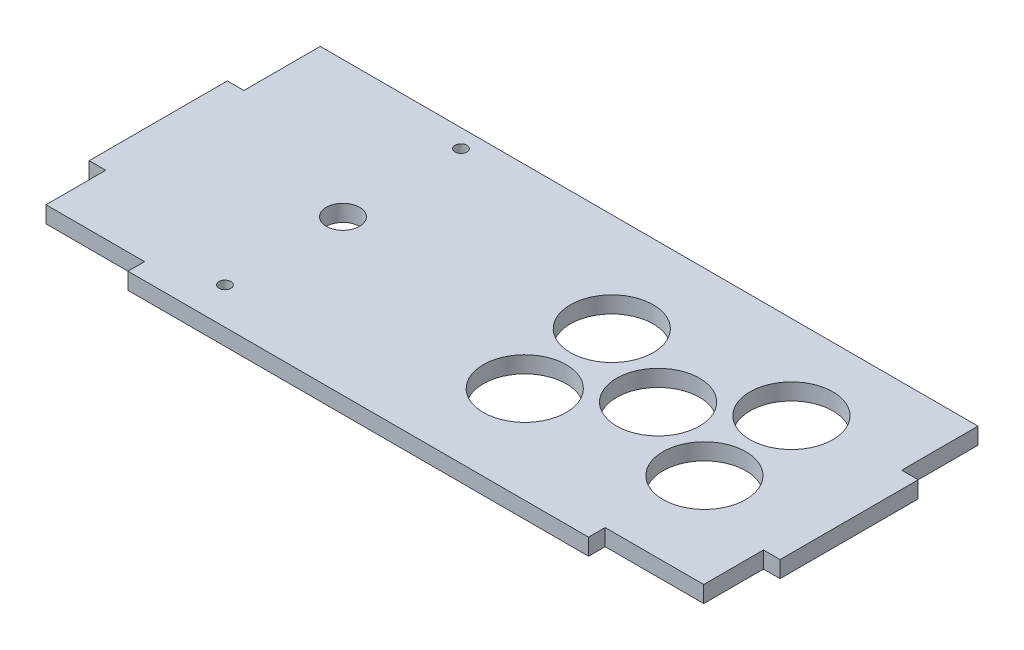
ISO-10303-21;
HEADER;
FILE_DESCRIPTION(('STEP AP214'),'2;1');
FILE_NAME('part.step','',(''),(''),'','','');
FILE_SCHEMA(('AUTOMOTIVE_DESIGN { 1 0 10303 214 1 1 1 1 }'));
ENDSEC;
DATA;
#1=APPLICATION_CONTEXT('core data for automotive mechanical design processes');
#2=APPLICATION_PROTOCOL_DEFINITION('international standard','automotive_design',2000,#1);
#3=PRODUCT_CONTEXT('',#1,'mechanical');
#4=PRODUCT('Part','Part','',(#3));
#5=PRODUCT_RELATED_PRODUCT_CATEGORY('part','',(#4));
#6=PRODUCT_DEFINITION_FORMATION('','',#4);
#7=PRODUCT_DEFINITION_CONTEXT('part definition',#1,'design');
#8=PRODUCT_DEFINITION('design','',#6,#7);
#9=PRODUCT_DEFINITION_SHAPE('','',#8);
#10=(LENGTH_UNIT() NAMED_UNIT(*) SI_UNIT(.MILLI.,.METRE.));
#11=(NAMED_UNIT(*) PLANE_ANGLE_UNIT() SI_UNIT($,.RADIAN.));
#12=(NAMED_UNIT(*) SI_UNIT($,.STERADIAN.) SOLID_ANGLE_UNIT());
#13=UNCERTAINTY_MEASURE_WITH_UNIT(LENGTH_MEASURE(1.E-05),#10,'distance_accuracy_value','');
#14=(GEOMETRIC_REPRESENTATION_CONTEXT(3) GLOBAL_UNCERTAINTY_ASSIGNED_CONTEXT((#13)) GLOBAL_UNIT_ASSIGNED_CONTEXT((#10,
#11,#12)) REPRESENTATION_CONTEXT('',''));
#15=CARTESIAN_POINT('',(0.,0.,0.));
#16=DIRECTION('',(0.,0.,1.));
#17=DIRECTION('',(1.,0.,0.));
#18=AXIS2_PLACEMENT_3D('',#15,#16,#17);
#19=CARTESIAN_POINT('',(125.,9.,-53.4646161357652));
#20=DIRECTION('',(1.,0.,0.));
#21=DIRECTION('',(0.,0.,-1.));
#22=AXIS2_PLACEMENT_3D('',#19,#20,#21);
#23=PLANE('',#22);
#24=DIRECTION('',(0.,0.,1.));
#25=VECTOR('',#24,1.);
#26=CARTESIAN_POINT('',(125.,9.,-53.4646161357652));
#27=LINE('',#26,#25);
#28=CARTESIAN_POINT('',(125.,9.,-131.087116135765));
#29=VERTEX_POINT('',#28);
#30=CARTESIAN_POINT('',(125.,9.,-81.0871161357652));
#31=VERTEX_POINT('',#30);
#32=EDGE_CURVE('E266',#29,#31,#27,.T.);
#33=ORIENTED_EDGE('',*,*,#32,.F.);
#34=DIRECTION('',(0.,1.,0.));
#35=VECTOR('',#34,1.);
#36=CARTESIAN_POINT('',(125.,3.,-131.087116135765));
#37=LINE('',#36,#35);
#38=CARTESIAN_POINT('',(125.,3.,-131.087116135765));
#39=VERTEX_POINT('',#38);
#40=EDGE_CURVE('E186',#39,#29,#37,.T.);
#41=ORIENTED_EDGE('',*,*,#40,.F.);
#42=DIRECTION('',(0.,0.,1.));
#43=VECTOR('',#42,1.);
#44=CARTESIAN_POINT('',(125.,3.,-53.4646161357652));
#45=LINE('',#44,#43);
#46=CARTESIAN_POINT('',(125.,3.,-81.0871161357652));
#47=VERTEX_POINT('',#46);
#48=EDGE_CURVE('E263',#39,#47,#45,.T.);
#49=ORIENTED_EDGE('',*,*,#48,.T.);
#50=DIRECTION('',(0.,1.,0.));
#51=VECTOR('',#50,1.);
#52=CARTESIAN_POINT('',(125.,3.,-81.0871161357652));
#53=LINE('',#52,#51);
#54=EDGE_CURVE('E190',#47,#31,#53,.T.);
#55=ORIENTED_EDGE('',*,*,#54,.T.);
#56=EDGE_LOOP('',(#33,#41,#49,#55));
#57=FACE_BOUND('',#56,.T.);
#58=ADVANCED_FACE('F35',(#57),#23,.F.);
#59=CARTESIAN_POINT('',(125.,9.,-53.4646161357652));
#60=DIRECTION('',(0.,0.,-1.));
#61=DIRECTION('',(-1.,0.,0.));
#62=AXIS2_PLACEMENT_3D('',#59,#60,#61);
#63=PLANE('',#62);
#64=DIRECTION('',(1.,0.,0.));
#65=VECTOR('',#64,1.);
#66=CARTESIAN_POINT('',(125.,9.,-53.4646161357652));
#67=LINE('',#66,#65);
#68=CARTESIAN_POINT('',(166.666666666667,9.,-53.4646161357652));
#69=VERTEX_POINT('',#68);
#70=CARTESIAN_POINT('',(333.333333333333,9.,-53.4646161357652));
#71=VERTEX_POINT('',#70);
#72=EDGE_CURVE('E269',#69,#71,#67,.T.);
#73=ORIENTED_EDGE('',*,*,#72,.F.);
#74=DIRECTION('',(0.,1.,0.));
#75=VECTOR('',#74,1.);
#76=CARTESIAN_POINT('',(166.666666666667,3.,-53.4646161357652));
#77=LINE('',#76,#75);
#78=CARTESIAN_POINT('',(166.666666666667,3.,-53.4646161357652));
#79=VERTEX_POINT('',#78);
#80=EDGE_CURVE('E243',#79,#69,#77,.T.);
#81=ORIENTED_EDGE('',*,*,#80,.F.);
#82=DIRECTION('',(1.,0.,0.));
#83=VECTOR('',#82,1.);
#84=CARTESIAN_POINT('',(125.,3.,-53.4646161357652));
#85=LINE('',#84,#83);
#86=CARTESIAN_POINT('',(333.333333333333,3.,-53.4646161357652));
#87=VERTEX_POINT('',#86);
#88=EDGE_CURVE('E275',#79,#87,#85,.T.);
#89=ORIENTED_EDGE('',*,*,#88,.T.);
#90=DIRECTION('',(0.,1.,0.));
#91=VECTOR('',#90,1.);
#92=CARTESIAN_POINT('',(333.333333333333,3.,-53.4646161357652));
#93=LINE('',#92,#91);
#94=EDGE_CURVE('E260',#87,#71,#93,.T.);
#95=ORIENTED_EDGE('',*,*,#94,.T.);
#96=EDGE_LOOP('',(#73,#81,#89,#95));
#97=FACE_BOUND('',#96,.T.);
#98=ADVANCED_FACE('F304',(#97),#63,.F.);
#99=CARTESIAN_POINT('',(375.,9.,-53.4646161357652));
#100=DIRECTION('',(-1.,0.,0.));
#101=DIRECTION('',(0.,0.,1.));
#102=AXIS2_PLACEMENT_3D('',#99,#100,#101);
#103=PLANE('',#102);
#104=DIRECTION('',(0.,0.,-1.));
#105=VECTOR('',#104,1.);
#106=CARTESIAN_POINT('',(375.,3.,-53.4646161357652));
#107=LINE('',#106,#105);
#108=CARTESIAN_POINT('',(375.,3.,-81.0871161357652));
#109=VERTEX_POINT('',#108);
#110=CARTESIAN_POINT('',(375.,3.,-131.087116135765));
#111=VERTEX_POINT('',#110);
#112=EDGE_CURVE('E276',#109,#111,#107,.T.);
#113=ORIENTED_EDGE('',*,*,#112,.T.);
#114=DIRECTION('',(0.,1.,0.));
#115=VECTOR('',#114,1.);
#116=CARTESIAN_POINT('',(375.,3.,-131.087116135765));
#117=LINE('',#116,#115);
#118=CARTESIAN_POINT('',(375.,9.,-131.087116135765));
#119=VERTEX_POINT('',#118);
#120=EDGE_CURVE('E169',#111,#119,#117,.T.);
#121=ORIENTED_EDGE('',*,*,#120,.T.);
#122=DIRECTION('',(0.,0.,-1.));
#123=VECTOR('',#122,1.);
#124=CARTESIAN_POINT('',(375.,9.,-53.4646161357652));
#125=LINE('',#124,#123);
#126=CARTESIAN_POINT('',(375.,9.,-81.0871161357652));
#127=VERTEX_POINT('',#126);
#128=EDGE_CURVE('E43',#127,#119,#125,.T.);
#129=ORIENTED_EDGE('',*,*,#128,.F.);
#130=DIRECTION('',(0.,1.,0.));
#131=VECTOR('',#130,1.);
#132=CARTESIAN_POINT('',(375.,3.,-81.0871161357652));
#133=LINE('',#132,#131);
#134=EDGE_CURVE('E215',#109,#127,#133,.T.);
#135=ORIENTED_EDGE('',*,*,#134,.F.);
#136=EDGE_LOOP('',(#113,#121,#129,#135));
#137=FACE_BOUND('',#136,.T.);
#138=ADVANCED_FACE('F286',(#137),#103,.F.);
#139=CARTESIAN_POINT('',(125.,9.,-158.709616135765));
#140=DIRECTION('',(0.,0.,1.));
#141=DIRECTION('',(1.,0.,0.));
#142=AXIS2_PLACEMENT_3D('',#139,#140,#141);
#143=PLANE('',#142);
#144=DIRECTION('',(-1.,0.,0.));
#145=VECTOR('',#144,1.);
#146=CARTESIAN_POINT('',(125.,9.,-158.709616135765));
#147=LINE('',#146,#145);
#148=CARTESIAN_POINT('',(369.,9.,-158.709616135765));
#149=VERTEX_POINT('',#148);
#150=CARTESIAN_POINT('',(131.,9.,-158.709616135765));
#151=VERTEX_POINT('',#150);
#152=EDGE_CURVE('E11',#149,#151,#147,.T.);
#153=ORIENTED_EDGE('',*,*,#152,.F.);
#154=DIRECTION('',(0.,1.,0.));
#155=VECTOR('',#154,1.);
#156=CARTESIAN_POINT('',(369.,3.,-158.709616135765));
#157=LINE('',#156,#155);
#158=CARTESIAN_POINT('',(369.,3.,-158.709616135765));
#159=VERTEX_POINT('',#158);
#160=EDGE_CURVE('E160',#159,#149,#157,.T.);
#161=ORIENTED_EDGE('',*,*,#160,.F.);
#162=DIRECTION('',(-1.,0.,0.));
#163=VECTOR('',#162,1.);
#164=CARTESIAN_POINT('',(125.,3.,-158.709616135765));
#165=LINE('',#164,#163);
#166=CARTESIAN_POINT('',(131.,3.,-158.709616135765));
#167=VERTEX_POINT('',#166);
#168=EDGE_CURVE('E38',#159,#167,#165,.T.);
#169=ORIENTED_EDGE('',*,*,#168,.T.);
#170=DIRECTION('',(0.,1.,0.));
#171=VECTOR('',#170,1.);
#172=CARTESIAN_POINT('',(131.,3.,-158.709616135765));
#173=LINE('',#172,#171);
#174=EDGE_CURVE('E226',#167,#151,#173,.T.);
#175=ORIENTED_EDGE('',*,*,#174,.T.);
#176=EDGE_LOOP('',(#153,#161,#169,#175));
#177=FACE_BOUND('',#176,.T.);
#178=ADVANCED_FACE('F281',(#177),#143,.F.);
#179=CARTESIAN_POINT('',(125.,9.,-53.4646161357652));
#180=DIRECTION('',(0.,-1.,0.));
#181=DIRECTION('',(0.,0.,-1.));
#182=AXIS2_PLACEMENT_3D('',#179,#180,#181);
#183=PLANE('',#182);
#184=CARTESIAN_POINT('',(275.228318114495,9.,-88.4802715709065));
#185=DIRECTION('',(0.,1.,0.));
#186=DIRECTION('',(0.,0.,1.));
#187=AXIS2_PLACEMENT_3D('',#184,#185,#186);
#188=CIRCLE('',#187,15.);
#189=CARTESIAN_POINT('',(275.228318114495,9.,-73.4802715709065));
#190=VERTEX_POINT('',#189);
#191=EDGE_CURVE('E517',#190,#190,#188,.T.);
#192=ORIENTED_EDGE('',*,*,#191,.F.);
#193=EDGE_LOOP('',(#192));
#194=FACE_BOUND('',#193,.T.);
#195=CARTESIAN_POINT('',(335.,9.,-93.7096161357652));
#196=DIRECTION('',(0.,1.,0.));
#197=DIRECTION('',(0.,0.,1.));
#198=AXIS2_PLACEMENT_3D('',#195,#196,#197);
#199=CIRCLE('',#198,15.);
#200=CARTESIAN_POINT('',(335.,9.,-78.7096161357652));
#201=VERTEX_POINT('',#200);
#202=EDGE_CURVE('E519',#201,#201,#199,.T.);
#203=ORIENTED_EDGE('',*,*,#202,.F.);
#204=EDGE_LOOP('',(#203));
#205=FACE_BOUND('',#204,.T.);
#206=CARTESIAN_POINT('',(303.604577311144,9.,-108.349542166592));
#207=DIRECTION('',(0.,1.,0.));
#208=DIRECTION('',(0.,0.,1.));
#209=AXIS2_PLACEMENT_3D('',#206,#207,#208);
#210=CIRCLE('',#209,15.);
#211=CARTESIAN_POINT('',(303.604577311144,9.,-93.349542166592));
#212=VERTEX_POINT('',#211);
#213=EDGE_CURVE('E527',#212,#212,#210,.T.);
#214=ORIENTED_EDGE('',*,*,#213,.F.);
#215=EDGE_LOOP('',(#214));
#216=FACE_BOUND('',#215,.T.);
#217=CARTESIAN_POINT('',(272.209154622289,9.,-122.989468197419));
#218=DIRECTION('',(0.,1.,0.));
#219=DIRECTION('',(0.,0.,1.));
#220=AXIS2_PLACEMENT_3D('',#217,#218,#219);
#221=CIRCLE('',#220,15.);
#222=CARTESIAN_POINT('',(272.209154622289,9.,-107.989468197419));
#223=VERTEX_POINT('',#222);
#224=EDGE_CURVE('E533',#223,#223,#221,.T.);
#225=ORIENTED_EDGE('',*,*,#224,.F.);
#226=EDGE_LOOP('',(#225));
#227=FACE_BOUND('',#226,.T.);
#228=CARTESIAN_POINT('',(331.980836507794,9.,-128.218812762278));
#229=DIRECTION('',(0.,1.,0.));
#230=DIRECTION('',(0.,0.,1.));
#231=AXIS2_PLACEMENT_3D('',#228,#229,#230);
#232=CIRCLE('',#231,15.);
#233=CARTESIAN_POINT('',(331.980836507794,9.,-113.218812762278));
#234=VERTEX_POINT('',#233);
#235=EDGE_CURVE('E539',#234,#234,#232,.T.);
#236=ORIENTED_EDGE('',*,*,#235,.F.);
#237=EDGE_LOOP('',(#236));
#238=FACE_BOUND('',#237,.T.);
#239=CARTESIAN_POINT('',(188.5,9.,-152.109616135765));
#240=DIRECTION('',(0.,-1.,0.));
#241=DIRECTION('',(0.,0.,-1.));
#242=AXIS2_PLACEMENT_3D('',#239,#240,#241);
#243=CIRCLE('',#242,2.14999999999999);
#244=CARTESIAN_POINT('',(188.5,9.,-154.259616135765));
#245=VERTEX_POINT('',#244);
#246=EDGE_CURVE('E548',#245,#245,#243,.T.);
#247=ORIENTED_EDGE('',*,*,#246,.T.);
#248=EDGE_LOOP('',(#247));
#249=FACE_BOUND('',#248,.T.);
#250=CARTESIAN_POINT('',(188.5,9.,-66.7096161357651));
#251=DIRECTION('',(0.,-1.,0.));
#252=DIRECTION('',(0.,0.,-1.));
#253=AXIS2_PLACEMENT_3D('',#250,#251,#252);
#254=CIRCLE('',#253,2.14999999999999);
#255=CARTESIAN_POINT('',(188.5,9.,-68.8596161357651));
#256=VERTEX_POINT('',#255);
#257=EDGE_CURVE('E554',#256,#256,#254,.T.);
#258=ORIENTED_EDGE('',*,*,#257,.T.);
#259=EDGE_LOOP('',(#258));
#260=FACE_BOUND('',#259,.T.);
#261=CARTESIAN_POINT('',(188.5,9.,-109.409616135765));
#262=DIRECTION('',(0.,1.,0.));
#263=DIRECTION('',(0.,0.,1.));
#264=AXIS2_PLACEMENT_3D('',#261,#262,#263);
#265=CIRCLE('',#264,6.00000000000001);
#266=CARTESIAN_POINT('',(188.5,9.,-103.409616135765));
#267=VERTEX_POINT('',#266);
#268=EDGE_CURVE('E556',#267,#267,#265,.T.);
#269=ORIENTED_EDGE('',*,*,#268,.F.);
#270=EDGE_LOOP('',(#269));
#271=FACE_BOUND('',#270,.T.);
#272=ORIENTED_EDGE('',*,*,#128,.T.);
#273=DIRECTION('',(1.,0.,0.));
#274=VECTOR('',#273,1.);
#275=CARTESIAN_POINT('',(375.,9.,-131.087116135765));
#276=LINE('',#275,#274);
#277=CARTESIAN_POINT('',(369.,9.,-131.087116135765));
#278=VERTEX_POINT('',#277);
#279=EDGE_CURVE('E173',#278,#119,#276,.T.);
#280=ORIENTED_EDGE('',*,*,#279,.F.);
#281=DIRECTION('',(0.,0.,1.));
#282=VECTOR('',#281,1.);
#283=CARTESIAN_POINT('',(369.,9.,-158.709616135765));
#284=LINE('',#283,#282);
#285=EDGE_CURVE('E161',#149,#278,#284,.T.);
#286=ORIENTED_EDGE('',*,*,#285,.F.);
#287=ORIENTED_EDGE('',*,*,#152,.T.);
#288=DIRECTION('',(0.,0.,-1.));
#289=VECTOR('',#288,1.);
#290=CARTESIAN_POINT('',(131.,9.,-158.709616135765));
#291=LINE('',#290,#289);
#292=CARTESIAN_POINT('',(131.,9.,-131.087116135765));
#293=VERTEX_POINT('',#292);
#294=EDGE_CURVE('E231',#293,#151,#291,.T.);
#295=ORIENTED_EDGE('',*,*,#294,.F.);
#296=DIRECTION('',(1.,0.,0.));
#297=VECTOR('',#296,1.);
#298=CARTESIAN_POINT('',(125.,9.,-131.087116135765));
#299=LINE('',#298,#297);
#300=EDGE_CURVE('E187',#29,#293,#299,.T.);
#301=ORIENTED_EDGE('',*,*,#300,.F.);
#302=ORIENTED_EDGE('',*,*,#32,.T.);
#303=DIRECTION('',(-1.,0.,0.));
#304=VECTOR('',#303,1.);
#305=CARTESIAN_POINT('',(125.,9.,-81.0871161357652));
#306=LINE('',#305,#304);
#307=CARTESIAN_POINT('',(131.,9.,-81.0871161357652));
#308=VERTEX_POINT('',#307);
#309=EDGE_CURVE('E196',#308,#31,#306,.T.);
#310=ORIENTED_EDGE('',*,*,#309,.F.);
#311=DIRECTION('',(0.,0.,-1.));
#312=VECTOR('',#311,1.);
#313=CARTESIAN_POINT('',(131.,9.,-59.4646161357652));
#314=LINE('',#313,#312);
#315=CARTESIAN_POINT('',(131.,9.,-59.4646161357652));
#316=VERTEX_POINT('',#315);
#317=EDGE_CURVE('E200',#316,#308,#314,.T.);
#318=ORIENTED_EDGE('',*,*,#317,.F.);
#319=DIRECTION('',(-1.,0.,0.));
#320=VECTOR('',#319,1.);
#321=CARTESIAN_POINT('',(125.,9.,-59.4646161357652));
#322=LINE('',#321,#320);
#323=CARTESIAN_POINT('',(166.666666666667,9.,-59.4646161357652));
#324=VERTEX_POINT('',#323);
#325=EDGE_CURVE('E240',#324,#316,#322,.T.);
#326=ORIENTED_EDGE('',*,*,#325,.F.);
#327=DIRECTION('',(0.,0.,-1.));
#328=VECTOR('',#327,1.);
#329=CARTESIAN_POINT('',(166.666666666667,9.,-53.4646161357652));
#330=LINE('',#329,#328);
#331=EDGE_CURVE('E221',#69,#324,#330,.T.);
#332=ORIENTED_EDGE('',*,*,#331,.F.);
#333=ORIENTED_EDGE('',*,*,#72,.T.);
#334=DIRECTION('',(0.,0.,1.));
#335=VECTOR('',#334,1.);
#336=CARTESIAN_POINT('',(333.333333333333,9.,-53.4646161357652));
#337=LINE('',#336,#335);
#338=CARTESIAN_POINT('',(333.333333333333,9.,-59.4646161357652));
#339=VERTEX_POINT('',#338);
#340=EDGE_CURVE('E253',#339,#71,#337,.T.);
#341=ORIENTED_EDGE('',*,*,#340,.F.);
#342=DIRECTION('',(-1.,0.,0.));
#343=VECTOR('',#342,1.);
#344=CARTESIAN_POINT('',(375.,9.,-59.4646161357652));
#345=LINE('',#344,#343);
#346=CARTESIAN_POINT('',(369.,9.,-59.4646161357652));
#347=VERTEX_POINT('',#346);
#348=EDGE_CURVE('E228',#347,#339,#345,.T.);
#349=ORIENTED_EDGE('',*,*,#348,.F.);
#350=DIRECTION('',(0.,0.,1.));
#351=VECTOR('',#350,1.);
#352=CARTESIAN_POINT('',(369.,9.,-59.4646161357652));
#353=LINE('',#352,#351);
#354=CARTESIAN_POINT('',(369.,9.,-81.0871161357652));
#355=VERTEX_POINT('',#354);
#356=EDGE_CURVE('E59',#355,#347,#353,.T.);
#357=ORIENTED_EDGE('',*,*,#356,.F.);
#358=DIRECTION('',(-1.,0.,0.));
#359=VECTOR('',#358,1.);
#360=CARTESIAN_POINT('',(375.,9.,-81.0871161357652));
#361=LINE('',#360,#359);
#362=EDGE_CURVE('E181',#127,#355,#361,.T.);
#363=ORIENTED_EDGE('',*,*,#362,.F.);
#364=EDGE_LOOP('',(#272,#280,#286,#287,#295,#301,#302,#310,#318,#326,#332,#333,#341,#349,#357,#363));
#365=FACE_BOUND('',#364,.T.);
#366=ADVANCED_FACE('F283',(#194,#205,#216,#227,#238,#249,#260,#271,#365),#183,.F.);
#367=CARTESIAN_POINT('',(125.,3.,-53.4646161357652));
#368=DIRECTION('',(0.,-1.,0.));
#369=DIRECTION('',(0.,0.,-1.));
#370=AXIS2_PLACEMENT_3D('',#367,#368,#369);
#371=PLANE('',#370);
#372=CARTESIAN_POINT('',(275.228318114495,3.,-88.4802715709065));
#373=DIRECTION('',(0.,1.,0.));
#374=DIRECTION('',(0.,0.,1.));
#375=AXIS2_PLACEMENT_3D('',#372,#373,#374);
#376=CIRCLE('',#375,15.);
#377=CARTESIAN_POINT('',(275.228318114495,3.,-73.4802715709065));
#378=VERTEX_POINT('',#377);
#379=EDGE_CURVE('E514',#378,#378,#376,.T.);
#380=ORIENTED_EDGE('',*,*,#379,.T.);
#381=EDGE_LOOP('',(#380));
#382=FACE_BOUND('',#381,.T.);
#383=CARTESIAN_POINT('',(335.,3.,-93.7096161357652));
#384=DIRECTION('',(0.,1.,0.));
#385=DIRECTION('',(0.,0.,1.));
#386=AXIS2_PLACEMENT_3D('',#383,#384,#385);
#387=CIRCLE('',#386,15.);
#388=CARTESIAN_POINT('',(335.,3.,-78.7096161357652));
#389=VERTEX_POINT('',#388);
#390=EDGE_CURVE('E524',#389,#389,#387,.T.);
#391=ORIENTED_EDGE('',*,*,#390,.T.);
#392=EDGE_LOOP('',(#391));
#393=FACE_BOUND('',#392,.T.);
#394=CARTESIAN_POINT('',(303.604577311144,3.,-108.349542166592));
#395=DIRECTION('',(0.,1.,0.));
#396=DIRECTION('',(0.,0.,1.));
#397=AXIS2_PLACEMENT_3D('',#394,#395,#396);
#398=CIRCLE('',#397,15.);
#399=CARTESIAN_POINT('',(303.604577311144,3.,-93.349542166592));
#400=VERTEX_POINT('',#399);
#401=EDGE_CURVE('E530',#400,#400,#398,.T.);
#402=ORIENTED_EDGE('',*,*,#401,.T.);
#403=EDGE_LOOP('',(#402));
#404=FACE_BOUND('',#403,.T.);
#405=CARTESIAN_POINT('',(272.209154622289,3.,-122.989468197419));
#406=DIRECTION('',(0.,1.,0.));
#407=DIRECTION('',(0.,0.,1.));
#408=AXIS2_PLACEMENT_3D('',#405,#406,#407);
#409=CIRCLE('',#408,15.);
#410=CARTESIAN_POINT('',(272.209154622289,3.,-107.989468197419));
#411=VERTEX_POINT('',#410);
#412=EDGE_CURVE('E536',#411,#411,#409,.T.);
#413=ORIENTED_EDGE('',*,*,#412,.T.);
#414=EDGE_LOOP('',(#413));
#415=FACE_BOUND('',#414,.T.);
#416=CARTESIAN_POINT('',(331.980836507794,3.,-128.218812762278));
#417=DIRECTION('',(0.,1.,0.));
#418=DIRECTION('',(0.,0.,1.));
#419=AXIS2_PLACEMENT_3D('',#416,#417,#418);
#420=CIRCLE('',#419,15.);
#421=CARTESIAN_POINT('',(331.980836507794,3.,-113.218812762278));
#422=VERTEX_POINT('',#421);
#423=EDGE_CURVE('E542',#422,#422,#420,.T.);
#424=ORIENTED_EDGE('',*,*,#423,.T.);
#425=EDGE_LOOP('',(#424));
#426=FACE_BOUND('',#425,.T.);
#427=CARTESIAN_POINT('',(188.5,3.,-152.109616135765));
#428=DIRECTION('',(0.,-1.,0.));
#429=DIRECTION('',(0.,0.,-1.));
#430=AXIS2_PLACEMENT_3D('',#427,#428,#429);
#431=CIRCLE('',#430,2.15000000000001);
#432=CARTESIAN_POINT('',(188.5,3.,-154.259616135765));
#433=VERTEX_POINT('',#432);
#434=EDGE_CURVE('E545',#433,#433,#431,.T.);
#435=ORIENTED_EDGE('',*,*,#434,.F.);
#436=EDGE_LOOP('',(#435));
#437=FACE_BOUND('',#436,.T.);
#438=CARTESIAN_POINT('',(188.5,3.,-66.7096161357651));
#439=DIRECTION('',(0.,-1.,0.));
#440=DIRECTION('',(0.,0.,-1.));
#441=AXIS2_PLACEMENT_3D('',#438,#439,#440);
#442=CIRCLE('',#441,2.15000000000001);
#443=CARTESIAN_POINT('',(188.5,3.,-68.8596161357651));
#444=VERTEX_POINT('',#443);
#445=EDGE_CURVE('E551',#444,#444,#442,.T.);
#446=ORIENTED_EDGE('',*,*,#445,.F.);
#447=EDGE_LOOP('',(#446));
#448=FACE_BOUND('',#447,.T.);
#449=CARTESIAN_POINT('',(188.5,3.,-109.409616135765));
#450=DIRECTION('',(0.,1.,0.));
#451=DIRECTION('',(0.,0.,1.));
#452=AXIS2_PLACEMENT_3D('',#449,#450,#451);
#453=CIRCLE('',#452,6.00000000000001);
#454=CARTESIAN_POINT('',(188.5,3.,-103.409616135765));
#455=VERTEX_POINT('',#454);
#456=EDGE_CURVE('E178',#455,#455,#453,.T.);
#457=ORIENTED_EDGE('',*,*,#456,.T.);
#458=EDGE_LOOP('',(#457));
#459=FACE_BOUND('',#458,.T.);
#460=DIRECTION('',(1.,0.,0.));
#461=VECTOR('',#460,1.);
#462=CARTESIAN_POINT('',(375.,3.,-131.087116135765));
#463=LINE('',#462,#461);
#464=CARTESIAN_POINT('',(369.,3.,-131.087116135765));
#465=VERTEX_POINT('',#464);
#466=EDGE_CURVE('E154',#465,#111,#463,.T.);
#467=ORIENTED_EDGE('',*,*,#466,.T.);
#468=ORIENTED_EDGE('',*,*,#112,.F.);
#469=DIRECTION('',(-1.,0.,0.));
#470=VECTOR('',#469,1.);
#471=CARTESIAN_POINT('',(375.,3.,-81.0871161357652));
#472=LINE('',#471,#470);
#473=CARTESIAN_POINT('',(369.,3.,-81.0871161357652));
#474=VERTEX_POINT('',#473);
#475=EDGE_CURVE('E209',#109,#474,#472,.T.);
#476=ORIENTED_EDGE('',*,*,#475,.T.);
#477=DIRECTION('',(0.,0.,1.));
#478=VECTOR('',#477,1.);
#479=CARTESIAN_POINT('',(369.,3.,-59.4646161357652));
#480=LINE('',#479,#478);
#481=CARTESIAN_POINT('',(369.,3.,-59.4646161357652));
#482=VERTEX_POINT('',#481);
#483=EDGE_CURVE('E212',#474,#482,#480,.T.);
#484=ORIENTED_EDGE('',*,*,#483,.T.);
#485=DIRECTION('',(-1.,0.,0.));
#486=VECTOR('',#485,1.);
#487=CARTESIAN_POINT('',(375.,3.,-59.4646161357652));
#488=LINE('',#487,#486);
#489=CARTESIAN_POINT('',(333.333333333333,3.,-59.4646161357652));
#490=VERTEX_POINT('',#489);
#491=EDGE_CURVE('E250',#482,#490,#488,.T.);
#492=ORIENTED_EDGE('',*,*,#491,.T.);
#493=DIRECTION('',(0.,0.,1.));
#494=VECTOR('',#493,1.);
#495=CARTESIAN_POINT('',(333.333333333333,3.,-53.4646161357652));
#496=LINE('',#495,#494);
#497=EDGE_CURVE('E252',#490,#87,#496,.T.);
#498=ORIENTED_EDGE('',*,*,#497,.T.);
#499=ORIENTED_EDGE('',*,*,#88,.F.);
#500=DIRECTION('',(0.,0.,-1.));
#501=VECTOR('',#500,1.);
#502=CARTESIAN_POINT('',(166.666666666667,3.,-53.4646161357652));
#503=LINE('',#502,#501);
#504=CARTESIAN_POINT('',(166.666666666667,3.,-59.4646161357652));
#505=VERTEX_POINT('',#504);
#506=EDGE_CURVE('E236',#79,#505,#503,.T.);
#507=ORIENTED_EDGE('',*,*,#506,.T.);
#508=DIRECTION('',(-1.,0.,0.));
#509=VECTOR('',#508,1.);
#510=CARTESIAN_POINT('',(125.,3.,-59.4646161357652));
#511=LINE('',#510,#509);
#512=CARTESIAN_POINT('',(131.,3.,-59.4646161357652));
#513=VERTEX_POINT('',#512);
#514=EDGE_CURVE('E239',#505,#513,#511,.T.);
#515=ORIENTED_EDGE('',*,*,#514,.T.);
#516=DIRECTION('',(0.,0.,-1.));
#517=VECTOR('',#516,1.);
#518=CARTESIAN_POINT('',(131.,3.,-59.4646161357652));
#519=LINE('',#518,#517);
#520=CARTESIAN_POINT('',(131.,3.,-81.0871161357652));
#521=VERTEX_POINT('',#520);
#522=EDGE_CURVE('E51',#513,#521,#519,.T.);
#523=ORIENTED_EDGE('',*,*,#522,.T.);
#524=DIRECTION('',(-1.,0.,0.));
#525=VECTOR('',#524,1.);
#526=CARTESIAN_POINT('',(125.,3.,-81.0871161357652));
#527=LINE('',#526,#525);
#528=EDGE_CURVE('E195',#521,#47,#527,.T.);
#529=ORIENTED_EDGE('',*,*,#528,.T.);
#530=ORIENTED_EDGE('',*,*,#48,.F.);
#531=DIRECTION('',(1.,0.,0.));
#532=VECTOR('',#531,1.);
#533=CARTESIAN_POINT('',(125.,3.,-131.087116135765));
#534=LINE('',#533,#532);
#535=CARTESIAN_POINT('',(131.,3.,-131.087116135765));
#536=VERTEX_POINT('',#535);
#537=EDGE_CURVE('E183',#39,#536,#534,.T.);
#538=ORIENTED_EDGE('',*,*,#537,.T.);
#539=DIRECTION('',(0.,0.,-1.));
#540=VECTOR('',#539,1.);
#541=CARTESIAN_POINT('',(131.,3.,-158.709616135765));
#542=LINE('',#541,#540);
#543=EDGE_CURVE('E229',#536,#167,#542,.T.);
#544=ORIENTED_EDGE('',*,*,#543,.T.);
#545=ORIENTED_EDGE('',*,*,#168,.F.);
#546=DIRECTION('',(0.,0.,1.));
#547=VECTOR('',#546,1.);
#548=CARTESIAN_POINT('',(369.,3.,-158.709616135765));
#549=LINE('',#548,#547);
#550=EDGE_CURVE('E149',#159,#465,#549,.T.);
#551=ORIENTED_EDGE('',*,*,#550,.T.);
#552=EDGE_LOOP('',(#467,#468,#476,#484,#492,#498,#499,#507,#515,#523,#529,#530,#538,#544,#545,#551));
#553=FACE_BOUND('',#552,.T.);
#554=ADVANCED_FACE('F151',(#382,#393,#404,#415,#426,#437,#448,#459,#553),#371,.T.);
#555=CARTESIAN_POINT('',(333.333333333333,3.,-53.4646161357652));
#556=DIRECTION('',(-1.,0.,0.));
#557=DIRECTION('',(0.,0.,1.));
#558=AXIS2_PLACEMENT_3D('',#555,#556,#557);
#559=PLANE('',#558);
#560=ORIENTED_EDGE('',*,*,#340,.T.);
#561=ORIENTED_EDGE('',*,*,#94,.F.);
#562=ORIENTED_EDGE('',*,*,#497,.F.);
#563=DIRECTION('',(0.,1.,0.));
#564=VECTOR('',#563,1.);
#565=CARTESIAN_POINT('',(333.333333333333,3.,-59.4646161357652));
#566=LINE('',#565,#564);
#567=EDGE_CURVE('E256',#490,#339,#566,.T.);
#568=ORIENTED_EDGE('',*,*,#567,.T.);
#569=EDGE_LOOP('',(#560,#561,#562,#568));
#570=FACE_BOUND('',#569,.T.);
#571=ADVANCED_FACE('F301',(#570),#559,.F.);
#572=CARTESIAN_POINT('',(375.,3.,-59.4646161357652));
#573=DIRECTION('',(0.,0.,-1.));
#574=DIRECTION('',(-1.,0.,0.));
#575=AXIS2_PLACEMENT_3D('',#572,#573,#574);
#576=PLANE('',#575);
#577=ORIENTED_EDGE('',*,*,#491,.F.);
#578=DIRECTION('',(0.,1.,0.));
#579=VECTOR('',#578,1.);
#580=CARTESIAN_POINT('',(369.,3.,-59.4646161357652));
#581=LINE('',#580,#579);
#582=EDGE_CURVE('E219',#482,#347,#581,.T.);
#583=ORIENTED_EDGE('',*,*,#582,.T.);
#584=ORIENTED_EDGE('',*,*,#348,.T.);
#585=ORIENTED_EDGE('',*,*,#567,.F.);
#586=EDGE_LOOP('',(#577,#583,#584,#585));
#587=FACE_BOUND('',#586,.T.);
#588=ADVANCED_FACE('F294',(#587),#576,.F.);
#589=CARTESIAN_POINT('',(125.,3.,-59.4646161357652));
#590=DIRECTION('',(0.,0.,-1.));
#591=DIRECTION('',(-1.,0.,0.));
#592=AXIS2_PLACEMENT_3D('',#589,#590,#591);
#593=PLANE('',#592);
#594=ORIENTED_EDGE('',*,*,#325,.T.);
#595=DIRECTION('',(0.,1.,0.));
#596=VECTOR('',#595,1.);
#597=CARTESIAN_POINT('',(131.,3.,-59.4646161357652));
#598=LINE('',#597,#596);
#599=EDGE_CURVE('E199',#513,#316,#598,.T.);
#600=ORIENTED_EDGE('',*,*,#599,.F.);
#601=ORIENTED_EDGE('',*,*,#514,.F.);
#602=DIRECTION('',(0.,1.,0.));
#603=VECTOR('',#602,1.);
#604=CARTESIAN_POINT('',(166.666666666667,3.,-59.4646161357652));
#605=LINE('',#604,#603);
#606=EDGE_CURVE('E233',#505,#324,#605,.T.);
#607=ORIENTED_EDGE('',*,*,#606,.T.);
#608=EDGE_LOOP('',(#594,#600,#601,#607));
#609=FACE_BOUND('',#608,.T.);
#610=ADVANCED_FACE('F312',(#609),#593,.F.);
#611=CARTESIAN_POINT('',(166.666666666667,3.,-53.4646161357652));
#612=DIRECTION('',(1.,0.,0.));
#613=DIRECTION('',(0.,0.,-1.));
#614=AXIS2_PLACEMENT_3D('',#611,#612,#613);
#615=PLANE('',#614);
#616=ORIENTED_EDGE('',*,*,#331,.T.);
#617=ORIENTED_EDGE('',*,*,#606,.F.);
#618=ORIENTED_EDGE('',*,*,#506,.F.);
#619=ORIENTED_EDGE('',*,*,#80,.T.);
#620=EDGE_LOOP('',(#616,#617,#618,#619));
#621=FACE_BOUND('',#620,.T.);
#622=ADVANCED_FACE('F309',(#621),#615,.F.);
#623=CARTESIAN_POINT('',(131.,3.,-158.709616135765));
#624=DIRECTION('',(1.,0.,0.));
#625=DIRECTION('',(0.,0.,-1.));
#626=AXIS2_PLACEMENT_3D('',#623,#624,#625);
#627=PLANE('',#626);
#628=ORIENTED_EDGE('',*,*,#294,.T.);
#629=ORIENTED_EDGE('',*,*,#174,.F.);
#630=ORIENTED_EDGE('',*,*,#543,.F.);
#631=DIRECTION('',(0.,1.,0.));
#632=VECTOR('',#631,1.);
#633=CARTESIAN_POINT('',(131.,3.,-131.087116135765));
#634=LINE('',#633,#632);
#635=EDGE_CURVE('E175',#536,#293,#634,.T.);
#636=ORIENTED_EDGE('',*,*,#635,.T.);
#637=EDGE_LOOP('',(#628,#629,#630,#636));
#638=FACE_BOUND('',#637,.T.);
#639=ADVANCED_FACE('F328',(#638),#627,.F.);
#640=CARTESIAN_POINT('',(369.,3.,-158.709616135765));
#641=DIRECTION('',(-1.,0.,0.));
#642=DIRECTION('',(0.,0.,1.));
#643=AXIS2_PLACEMENT_3D('',#640,#641,#642);
#644=PLANE('',#643);
#645=ORIENTED_EDGE('',*,*,#285,.T.);
#646=DIRECTION('',(0.,1.,0.));
#647=VECTOR('',#646,1.);
#648=CARTESIAN_POINT('',(369.,3.,-131.087116135765));
#649=LINE('',#648,#647);
#650=EDGE_CURVE('E164',#465,#278,#649,.T.);
#651=ORIENTED_EDGE('',*,*,#650,.F.);
#652=ORIENTED_EDGE('',*,*,#550,.F.);
#653=ORIENTED_EDGE('',*,*,#160,.T.);
#654=EDGE_LOOP('',(#645,#651,#652,#653));
#655=FACE_BOUND('',#654,.T.);
#656=ADVANCED_FACE('F165',(#655),#644,.F.);
#657=CARTESIAN_POINT('',(369.,3.,-59.4646161357652));
#658=DIRECTION('',(-1.,0.,0.));
#659=DIRECTION('',(0.,0.,1.));
#660=AXIS2_PLACEMENT_3D('',#657,#658,#659);
#661=PLANE('',#660);
#662=ORIENTED_EDGE('',*,*,#356,.T.);
#663=ORIENTED_EDGE('',*,*,#582,.F.);
#664=ORIENTED_EDGE('',*,*,#483,.F.);
#665=DIRECTION('',(0.,1.,0.));
#666=VECTOR('',#665,1.);
#667=CARTESIAN_POINT('',(369.,3.,-81.0871161357652));
#668=LINE('',#667,#666);
#669=EDGE_CURVE('E222',#474,#355,#668,.T.);
#670=ORIENTED_EDGE('',*,*,#669,.T.);
#671=EDGE_LOOP('',(#662,#663,#664,#670));
#672=FACE_BOUND('',#671,.T.);
#673=ADVANCED_FACE('F291',(#672),#661,.F.);
#674=CARTESIAN_POINT('',(375.,3.,-81.0871161357652));
#675=DIRECTION('',(0.,0.,-1.));
#676=DIRECTION('',(-1.,0.,0.));
#677=AXIS2_PLACEMENT_3D('',#674,#675,#676);
#678=PLANE('',#677);
#679=ORIENTED_EDGE('',*,*,#362,.T.);
#680=ORIENTED_EDGE('',*,*,#669,.F.);
#681=ORIENTED_EDGE('',*,*,#475,.F.);
#682=ORIENTED_EDGE('',*,*,#134,.T.);
#683=EDGE_LOOP('',(#679,#680,#681,#682));
#684=FACE_BOUND('',#683,.T.);
#685=ADVANCED_FACE('F290',(#684),#678,.F.);
#686=CARTESIAN_POINT('',(375.,3.,-131.087116135765));
#687=DIRECTION('',(0.,0.,1.));
#688=DIRECTION('',(1.,0.,0.));
#689=AXIS2_PLACEMENT_3D('',#686,#687,#688);
#690=PLANE('',#689);
#691=ORIENTED_EDGE('',*,*,#279,.T.);
#692=ORIENTED_EDGE('',*,*,#120,.F.);
#693=ORIENTED_EDGE('',*,*,#466,.F.);
#694=ORIENTED_EDGE('',*,*,#650,.T.);
#695=EDGE_LOOP('',(#691,#692,#693,#694));
#696=FACE_BOUND('',#695,.T.);
#697=ADVANCED_FACE('F171',(#696),#690,.F.);
#698=CARTESIAN_POINT('',(125.,3.,-131.087116135765));
#699=DIRECTION('',(0.,0.,1.));
#700=DIRECTION('',(1.,0.,0.));
#701=AXIS2_PLACEMENT_3D('',#698,#699,#700);
#702=PLANE('',#701);
#703=ORIENTED_EDGE('',*,*,#300,.T.);
#704=ORIENTED_EDGE('',*,*,#635,.F.);
#705=ORIENTED_EDGE('',*,*,#537,.F.);
#706=ORIENTED_EDGE('',*,*,#40,.T.);
#707=EDGE_LOOP('',(#703,#704,#705,#706));
#708=FACE_BOUND('',#707,.T.);
#709=ADVANCED_FACE('F326',(#708),#702,.F.);
#710=CARTESIAN_POINT('',(125.,3.,-81.0871161357652));
#711=DIRECTION('',(0.,0.,-1.));
#712=DIRECTION('',(-1.,0.,0.));
#713=AXIS2_PLACEMENT_3D('',#710,#711,#712);
#714=PLANE('',#713);
#715=ORIENTED_EDGE('',*,*,#309,.T.);
#716=ORIENTED_EDGE('',*,*,#54,.F.);
#717=ORIENTED_EDGE('',*,*,#528,.F.);
#718=DIRECTION('',(0.,1.,0.));
#719=VECTOR('',#718,1.);
#720=CARTESIAN_POINT('',(131.,3.,-81.0871161357652));
#721=LINE('',#720,#719);
#722=EDGE_CURVE('E206',#521,#308,#721,.T.);
#723=ORIENTED_EDGE('',*,*,#722,.T.);
#724=EDGE_LOOP('',(#715,#716,#717,#723));
#725=FACE_BOUND('',#724,.T.);
#726=ADVANCED_FACE('F319',(#725),#714,.F.);
#727=CARTESIAN_POINT('',(131.,3.,-59.4646161357652));
#728=DIRECTION('',(1.,0.,0.));
#729=DIRECTION('',(0.,0.,-1.));
#730=AXIS2_PLACEMENT_3D('',#727,#728,#729);
#731=PLANE('',#730);
#732=ORIENTED_EDGE('',*,*,#317,.T.);
#733=ORIENTED_EDGE('',*,*,#722,.F.);
#734=ORIENTED_EDGE('',*,*,#522,.F.);
#735=ORIENTED_EDGE('',*,*,#599,.T.);
#736=EDGE_LOOP('',(#732,#733,#734,#735));
#737=FACE_BOUND('',#736,.T.);
#738=ADVANCED_FACE('F314',(#737),#731,.F.);
#739=CARTESIAN_POINT('',(188.5,9.,-109.409616135765));
#740=DIRECTION('',(0.,1.,0.));
#741=DIRECTION('',(0.,0.,1.));
#742=AXIS2_PLACEMENT_3D('',#739,#740,#741);
#743=CYLINDRICAL_SURFACE('',#742,6.00000000000001);
#744=ORIENTED_EDGE('',*,*,#456,.F.);
#745=EDGE_LOOP('',(#744));
#746=FACE_BOUND('',#745,.T.);
#747=ORIENTED_EDGE('',*,*,#268,.T.);
#748=EDGE_LOOP('',(#747));
#749=FACE_BOUND('',#748,.T.);
#750=ADVANCED_FACE('F428',(#746,#749),#743,.F.);
#751=CARTESIAN_POINT('',(188.5,3.,-66.7096161357651));
#752=DIRECTION('',(0.,-1.,0.));
#753=DIRECTION('',(0.,0.,-1.));
#754=AXIS2_PLACEMENT_3D('',#751,#752,#753);
#755=CYLINDRICAL_SURFACE('',#754,2.15);
#756=ORIENTED_EDGE('',*,*,#257,.F.);
#757=EDGE_LOOP('',(#756));
#758=FACE_BOUND('',#757,.T.);
#759=ORIENTED_EDGE('',*,*,#445,.T.);
#760=EDGE_LOOP('',(#759));
#761=FACE_BOUND('',#760,.T.);
#762=ADVANCED_FACE('F437',(#758,#761),#755,.F.);
#763=CARTESIAN_POINT('',(188.5,3.,-152.109616135765));
#764=DIRECTION('',(0.,-1.,0.));
#765=DIRECTION('',(0.,0.,-1.));
#766=AXIS2_PLACEMENT_3D('',#763,#764,#765);
#767=CYLINDRICAL_SURFACE('',#766,2.15);
#768=ORIENTED_EDGE('',*,*,#246,.F.);
#769=EDGE_LOOP('',(#768));
#770=FACE_BOUND('',#769,.T.);
#771=ORIENTED_EDGE('',*,*,#434,.T.);
#772=EDGE_LOOP('',(#771));
#773=FACE_BOUND('',#772,.T.);
#774=ADVANCED_FACE('F444',(#770,#773),#767,.F.);
#775=CARTESIAN_POINT('',(331.980836507794,9.,-128.218812762278));
#776=DIRECTION('',(0.,1.,0.));
#777=DIRECTION('',(0.,0.,1.));
#778=AXIS2_PLACEMENT_3D('',#775,#776,#777);
#779=CYLINDRICAL_SURFACE('',#778,15.);
#780=ORIENTED_EDGE('',*,*,#423,.F.);
#781=EDGE_LOOP('',(#780));
#782=FACE_BOUND('',#781,.T.);
#783=ORIENTED_EDGE('',*,*,#235,.T.);
#784=EDGE_LOOP('',(#783));
#785=FACE_BOUND('',#784,.T.);
#786=ADVANCED_FACE('F452',(#782,#785),#779,.F.);
#787=CARTESIAN_POINT('',(272.209154622289,9.,-122.989468197419));
#788=DIRECTION('',(0.,1.,0.));
#789=DIRECTION('',(0.,0.,1.));
#790=AXIS2_PLACEMENT_3D('',#787,#788,#789);
#791=CYLINDRICAL_SURFACE('',#790,15.);
#792=ORIENTED_EDGE('',*,*,#412,.F.);
#793=EDGE_LOOP('',(#792));
#794=FACE_BOUND('',#793,.T.);
#795=ORIENTED_EDGE('',*,*,#224,.T.);
#796=EDGE_LOOP('',(#795));
#797=FACE_BOUND('',#796,.T.);
#798=ADVANCED_FACE('F460',(#794,#797),#791,.F.);
#799=CARTESIAN_POINT('',(303.604577311144,9.,-108.349542166592));
#800=DIRECTION('',(0.,1.,0.));
#801=DIRECTION('',(0.,0.,1.));
#802=AXIS2_PLACEMENT_3D('',#799,#800,#801);
#803=CYLINDRICAL_SURFACE('',#802,15.);
#804=ORIENTED_EDGE('',*,*,#401,.F.);
#805=EDGE_LOOP('',(#804));
#806=FACE_BOUND('',#805,.T.);
#807=ORIENTED_EDGE('',*,*,#213,.T.);
#808=EDGE_LOOP('',(#807));
#809=FACE_BOUND('',#808,.T.);
#810=ADVANCED_FACE('F468',(#806,#809),#803,.F.);
#811=CARTESIAN_POINT('',(335.,9.,-93.7096161357652));
#812=DIRECTION('',(0.,1.,0.));
#813=DIRECTION('',(0.,0.,1.));
#814=AXIS2_PLACEMENT_3D('',#811,#812,#813);
#815=CYLINDRICAL_SURFACE('',#814,15.);
#816=ORIENTED_EDGE('',*,*,#390,.F.);
#817=EDGE_LOOP('',(#816));
#818=FACE_BOUND('',#817,.T.);
#819=ORIENTED_EDGE('',*,*,#202,.T.);
#820=EDGE_LOOP('',(#819));
#821=FACE_BOUND('',#820,.T.);
#822=ADVANCED_FACE('F476',(#818,#821),#815,.F.);
#823=CARTESIAN_POINT('',(275.228318114495,9.,-88.4802715709065));
#824=DIRECTION('',(0.,1.,0.));
#825=DIRECTION('',(0.,0.,1.));
#826=AXIS2_PLACEMENT_3D('',#823,#824,#825);
#827=CYLINDRICAL_SURFACE('',#826,15.);
#828=ORIENTED_EDGE('',*,*,#379,.F.);
#829=EDGE_LOOP('',(#828));
#830=FACE_BOUND('',#829,.T.);
#831=ORIENTED_EDGE('',*,*,#191,.T.);
#832=EDGE_LOOP('',(#831));
#833=FACE_BOUND('',#832,.T.);
#834=ADVANCED_FACE('F484',(#830,#833),#827,.F.);
#835=CLOSED_SHELL('',(#58,#98,#138,#178,#366,#554,#571,#588,#610,#622,#639,#656,#673,#685,#697,
#709,#726,#738,#750,#762,#774,#786,#798,#810,#822,#834));
#836=MANIFOLD_SOLID_BREP('B2',#835);
#837=ADVANCED_BREP_SHAPE_REPRESENTATION('',(#18,#836),#14);
#838=SHAPE_DEFINITION_REPRESENTATION(#9,#837);
ENDSEC;
END-ISO-10303-21;
